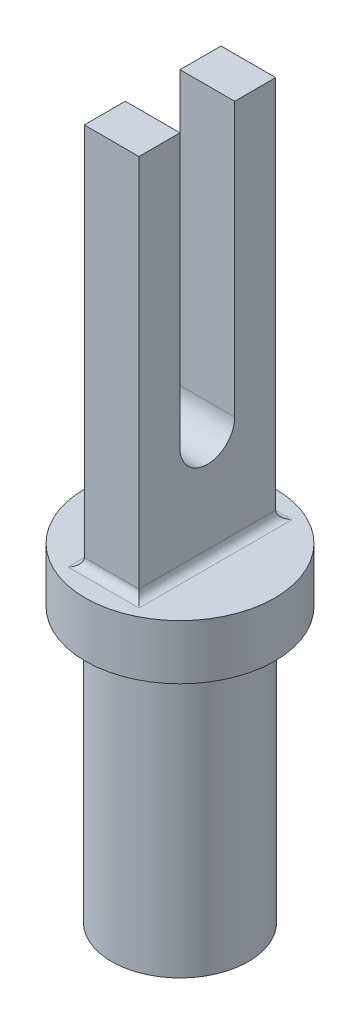
ISO-10303-21;
HEADER;
FILE_DESCRIPTION(('STEP AP214'),'2;1');
FILE_NAME('part.step','',(''),(''),'','','');
FILE_SCHEMA(('AUTOMOTIVE_DESIGN { 1 0 10303 214 1 1 1 1 }'));
ENDSEC;
DATA;
#1=APPLICATION_CONTEXT('core data for automotive mechanical design processes');
#2=APPLICATION_PROTOCOL_DEFINITION('international standard','automotive_design',2000,#1);
#3=PRODUCT_CONTEXT('',#1,'mechanical');
#4=PRODUCT('Part','Part','',(#3));
#5=PRODUCT_RELATED_PRODUCT_CATEGORY('part','',(#4));
#6=PRODUCT_DEFINITION_FORMATION('','',#4);
#7=PRODUCT_DEFINITION_CONTEXT('part definition',#1,'design');
#8=PRODUCT_DEFINITION('design','',#6,#7);
#9=PRODUCT_DEFINITION_SHAPE('','',#8);
#10=(LENGTH_UNIT() NAMED_UNIT(*) SI_UNIT(.MILLI.,.METRE.));
#11=(NAMED_UNIT(*) PLANE_ANGLE_UNIT() SI_UNIT($,.RADIAN.));
#12=(NAMED_UNIT(*) SI_UNIT($,.STERADIAN.) SOLID_ANGLE_UNIT());
#13=UNCERTAINTY_MEASURE_WITH_UNIT(LENGTH_MEASURE(1.E-05),#10,'distance_accuracy_value','');
#14=(GEOMETRIC_REPRESENTATION_CONTEXT(3) GLOBAL_UNCERTAINTY_ASSIGNED_CONTEXT((#13)) GLOBAL_UNIT_ASSIGNED_CONTEXT((#10,
#11,#12)) REPRESENTATION_CONTEXT('',''));
#15=CARTESIAN_POINT('',(0.,0.,0.));
#16=DIRECTION('',(0.,0.,1.));
#17=DIRECTION('',(1.,0.,0.));
#18=AXIS2_PLACEMENT_3D('',#15,#16,#17);
#19=CARTESIAN_POINT('',(5.,70.,12.5));
#20=DIRECTION('',(-1.,0.,0.));
#21=DIRECTION('',(0.,0.,1.));
#22=AXIS2_PLACEMENT_3D('',#19,#20,#21);
#23=PLANE('',#22);
#24=DIRECTION('',(0.,1.,0.));
#25=VECTOR('',#24,1.);
#26=CARTESIAN_POINT('',(5.,70.,-4.99999999999999));
#27=LINE('',#26,#25);
#28=CARTESIAN_POINT('',(5.,20.,-4.99999999999999));
#29=VERTEX_POINT('',#28);
#30=CARTESIAN_POINT('',(5.,70.,-4.99999999999999));
#31=VERTEX_POINT('',#30);
#32=EDGE_CURVE('E138',#29,#31,#27,.T.);
#33=ORIENTED_EDGE('',*,*,#32,.F.);
#34=CARTESIAN_POINT('',(5.,20.,0.));
#35=DIRECTION('',(-1.,0.,0.));
#36=DIRECTION('',(0.,0.,1.));
#37=AXIS2_PLACEMENT_3D('',#34,#35,#36);
#38=CIRCLE('',#37,5.);
#39=CARTESIAN_POINT('',(5.,20.,5.));
#40=VERTEX_POINT('',#39);
#41=EDGE_CURVE('E119',#29,#40,#38,.T.);
#42=ORIENTED_EDGE('',*,*,#41,.T.);
#43=DIRECTION('',(0.,-1.,0.));
#44=VECTOR('',#43,1.);
#45=CARTESIAN_POINT('',(5.,70.,4.99999999999999));
#46=LINE('',#45,#44);
#47=CARTESIAN_POINT('',(5.,70.,4.99999999999999));
#48=VERTEX_POINT('',#47);
#49=EDGE_CURVE('E135',#48,#40,#46,.T.);
#50=ORIENTED_EDGE('',*,*,#49,.F.);
#51=DIRECTION('',(0.,0.,-1.));
#52=VECTOR('',#51,1.);
#53=CARTESIAN_POINT('',(5.,70.,12.5));
#54=LINE('',#53,#52);
#55=CARTESIAN_POINT('',(5.,70.,12.5));
#56=VERTEX_POINT('',#55);
#57=EDGE_CURVE('E142',#56,#48,#54,.T.);
#58=ORIENTED_EDGE('',*,*,#57,.F.);
#59=DIRECTION('',(0.,-1.,0.));
#60=VECTOR('',#59,1.);
#61=CARTESIAN_POINT('',(5.,70.,12.5));
#62=LINE('',#61,#60);
#63=CARTESIAN_POINT('',(5.,1.5,12.5));
#64=VERTEX_POINT('',#63);
#65=EDGE_CURVE('E153',#56,#64,#62,.T.);
#66=ORIENTED_EDGE('',*,*,#65,.T.);
#67=DIRECTION('',(0.,0.,-1.));
#68=VECTOR('',#67,1.);
#69=CARTESIAN_POINT('',(5.,1.5,12.5));
#70=LINE('',#69,#68);
#71=CARTESIAN_POINT('',(5.,1.5,-12.5));
#72=VERTEX_POINT('',#71);
#73=EDGE_CURVE('E187',#64,#72,#70,.T.);
#74=ORIENTED_EDGE('',*,*,#73,.T.);
#75=DIRECTION('',(0.,-1.,0.));
#76=VECTOR('',#75,1.);
#77=CARTESIAN_POINT('',(5.,70.,-12.5));
#78=LINE('',#77,#76);
#79=CARTESIAN_POINT('',(5.,70.,-12.5));
#80=VERTEX_POINT('',#79);
#81=EDGE_CURVE('E160',#80,#72,#78,.T.);
#82=ORIENTED_EDGE('',*,*,#81,.F.);
#83=EDGE_CURVE('E146',#31,#80,#54,.T.);
#84=ORIENTED_EDGE('',*,*,#83,.F.);
#85=EDGE_LOOP('',(#33,#42,#50,#58,#66,#74,#82,#84));
#86=FACE_BOUND('',#85,.T.);
#87=ADVANCED_FACE('F33',(#86),#23,.F.);
#88=CARTESIAN_POINT('',(-5.,70.,12.5));
#89=DIRECTION('',(1.,0.,0.));
#90=DIRECTION('',(0.,0.,-1.));
#91=AXIS2_PLACEMENT_3D('',#88,#89,#90);
#92=PLANE('',#91);
#93=DIRECTION('',(0.,1.,0.));
#94=VECTOR('',#93,1.);
#95=CARTESIAN_POINT('',(-5.,0.,-4.99999999999999));
#96=LINE('',#95,#94);
#97=CARTESIAN_POINT('',(-5.,20.,-4.99999999999999));
#98=VERTEX_POINT('',#97);
#99=CARTESIAN_POINT('',(-5.,70.,-4.99999999999999));
#100=VERTEX_POINT('',#99);
#101=EDGE_CURVE('E125',#98,#100,#96,.T.);
#102=ORIENTED_EDGE('',*,*,#101,.T.);
#103=DIRECTION('',(0.,0.,1.));
#104=VECTOR('',#103,1.);
#105=CARTESIAN_POINT('',(-5.,70.,12.5));
#106=LINE('',#105,#104);
#107=CARTESIAN_POINT('',(-5.,70.,-12.5));
#108=VERTEX_POINT('',#107);
#109=EDGE_CURVE('E149',#108,#100,#106,.T.);
#110=ORIENTED_EDGE('',*,*,#109,.F.);
#111=DIRECTION('',(0.,-1.,0.));
#112=VECTOR('',#111,1.);
#113=CARTESIAN_POINT('',(-5.,70.,-12.5));
#114=LINE('',#113,#112);
#115=CARTESIAN_POINT('',(-5.,1.5,-12.5));
#116=VERTEX_POINT('',#115);
#117=EDGE_CURVE('E158',#108,#116,#114,.T.);
#118=ORIENTED_EDGE('',*,*,#117,.T.);
#119=DIRECTION('',(0.,0.,1.));
#120=VECTOR('',#119,1.);
#121=CARTESIAN_POINT('',(-5.,1.5,12.5));
#122=LINE('',#121,#120);
#123=CARTESIAN_POINT('',(-5.,1.5,12.5));
#124=VERTEX_POINT('',#123);
#125=EDGE_CURVE('E56',#116,#124,#122,.T.);
#126=ORIENTED_EDGE('',*,*,#125,.T.);
#127=DIRECTION('',(0.,-1.,0.));
#128=VECTOR('',#127,1.);
#129=CARTESIAN_POINT('',(-5.,70.,12.5));
#130=LINE('',#129,#128);
#131=CARTESIAN_POINT('',(-5.,70.,12.5));
#132=VERTEX_POINT('',#131);
#133=EDGE_CURVE('E156',#132,#124,#130,.T.);
#134=ORIENTED_EDGE('',*,*,#133,.F.);
#135=CARTESIAN_POINT('',(-5.,70.,5.00000000000001));
#136=VERTEX_POINT('',#135);
#137=EDGE_CURVE('E148',#136,#132,#106,.T.);
#138=ORIENTED_EDGE('',*,*,#137,.F.);
#139=DIRECTION('',(0.,-1.,0.));
#140=VECTOR('',#139,1.);
#141=CARTESIAN_POINT('',(-5.,0.,4.99999999999999));
#142=LINE('',#141,#140);
#143=CARTESIAN_POINT('',(-5.,20.,5.));
#144=VERTEX_POINT('',#143);
#145=EDGE_CURVE('E48',#136,#144,#142,.T.);
#146=ORIENTED_EDGE('',*,*,#145,.T.);
#147=CARTESIAN_POINT('',(-5.,20.,0.));
#148=DIRECTION('',(-1.,0.,0.));
#149=DIRECTION('',(0.,0.,1.));
#150=AXIS2_PLACEMENT_3D('',#147,#148,#149);
#151=CIRCLE('',#150,5.);
#152=EDGE_CURVE('E117',#98,#144,#151,.T.);
#153=ORIENTED_EDGE('',*,*,#152,.F.);
#154=EDGE_LOOP('',(#102,#110,#118,#126,#134,#138,#146,#153));
#155=FACE_BOUND('',#154,.T.);
#156=ADVANCED_FACE('F130',(#155),#92,.F.);
#157=CARTESIAN_POINT('',(0.,70.,0.));
#158=DIRECTION('',(0.,1.,0.));
#159=DIRECTION('',(0.,0.,1.));
#160=AXIS2_PLACEMENT_3D('',#157,#158,#159);
#161=PLANE('',#160);
#162=ORIENTED_EDGE('',*,*,#109,.T.);
#163=DIRECTION('',(1.,0.,0.));
#164=VECTOR('',#163,1.);
#165=CARTESIAN_POINT('',(0.,70.,-4.99999999999999));
#166=LINE('',#165,#164);
#167=EDGE_CURVE('E11',#100,#31,#166,.T.);
#168=ORIENTED_EDGE('',*,*,#167,.T.);
#169=ORIENTED_EDGE('',*,*,#83,.T.);
#170=DIRECTION('',(-1.,0.,0.));
#171=VECTOR('',#170,1.);
#172=CARTESIAN_POINT('',(5.,70.,-12.5));
#173=LINE('',#172,#171);
#174=EDGE_CURVE('E145',#80,#108,#173,.T.);
#175=ORIENTED_EDGE('',*,*,#174,.T.);
#176=EDGE_LOOP('',(#162,#168,#169,#175));
#177=FACE_BOUND('',#176,.T.);
#178=ADVANCED_FACE('F225',(#177),#161,.T.);
#179=ORIENTED_EDGE('',*,*,#57,.T.);
#180=DIRECTION('',(-1.,0.,0.));
#181=VECTOR('',#180,1.);
#182=CARTESIAN_POINT('',(0.,70.,4.99999999999999));
#183=LINE('',#182,#181);
#184=EDGE_CURVE('E41',#48,#136,#183,.T.);
#185=ORIENTED_EDGE('',*,*,#184,.T.);
#186=ORIENTED_EDGE('',*,*,#137,.T.);
#187=DIRECTION('',(1.,0.,0.));
#188=VECTOR('',#187,1.);
#189=CARTESIAN_POINT('',(5.,70.,12.5));
#190=LINE('',#189,#188);
#191=EDGE_CURVE('E151',#132,#56,#190,.T.);
#192=ORIENTED_EDGE('',*,*,#191,.T.);
#193=EDGE_LOOP('',(#179,#185,#186,#192));
#194=FACE_BOUND('',#193,.T.);
#195=ADVANCED_FACE('F201',(#194),#161,.T.);
#196=CARTESIAN_POINT('',(0.,-10.,0.));
#197=DIRECTION('',(0.,1.,0.));
#198=DIRECTION('',(0.,0.,1.));
#199=AXIS2_PLACEMENT_3D('',#196,#197,#198);
#200=CYLINDRICAL_SURFACE('',#199,17.325);
#201=CARTESIAN_POINT('',(0.,-10.,0.));
#202=DIRECTION('',(0.,1.,0.));
#203=DIRECTION('',(0.,0.,1.));
#204=AXIS2_PLACEMENT_3D('',#201,#202,#203);
#205=CIRCLE('',#204,17.325);
#206=CARTESIAN_POINT('',(0.,-10.,17.325));
#207=VERTEX_POINT('',#206);
#208=EDGE_CURVE('E171',#207,#207,#205,.T.);
#209=ORIENTED_EDGE('',*,*,#208,.T.);
#210=EDGE_LOOP('',(#209));
#211=FACE_BOUND('',#210,.T.);
#212=CARTESIAN_POINT('',(0.,0.,0.));
#213=DIRECTION('',(0.,1.,0.));
#214=DIRECTION('',(0.,0.,1.));
#215=AXIS2_PLACEMENT_3D('',#212,#213,#214);
#216=CIRCLE('',#215,17.325);
#217=CARTESIAN_POINT('',(0.,0.,17.325));
#218=VERTEX_POINT('',#217);
#219=EDGE_CURVE('E166',#218,#218,#216,.T.);
#220=ORIENTED_EDGE('',*,*,#219,.F.);
#221=EDGE_LOOP('',(#220));
#222=FACE_BOUND('',#221,.T.);
#223=ADVANCED_FACE('F242',(#211,#222),#200,.T.);
#224=CARTESIAN_POINT('',(0.,-10.,0.));
#225=DIRECTION('',(0.,1.,0.));
#226=DIRECTION('',(0.,0.,1.));
#227=AXIS2_PLACEMENT_3D('',#224,#225,#226);
#228=PLANE('',#227);
#229=CARTESIAN_POINT('',(0.,-10.,0.));
#230=DIRECTION('',(0.,-1.,0.));
#231=DIRECTION('',(0.,0.,-1.));
#232=AXIS2_PLACEMENT_3D('',#229,#230,#231);
#233=CIRCLE('',#232,12.5);
#234=CARTESIAN_POINT('',(0.,-10.,-12.5));
#235=VERTEX_POINT('',#234);
#236=EDGE_CURVE('E167',#235,#235,#233,.T.);
#237=ORIENTED_EDGE('',*,*,#236,.F.);
#238=EDGE_LOOP('',(#237));
#239=FACE_BOUND('',#238,.T.);
#240=ORIENTED_EDGE('',*,*,#208,.F.);
#241=EDGE_LOOP('',(#240));
#242=FACE_BOUND('',#241,.T.);
#243=ADVANCED_FACE('F239',(#239,#242),#228,.F.);
#244=CARTESIAN_POINT('',(0.,0.,0.));
#245=DIRECTION('',(0.,1.,0.));
#246=DIRECTION('',(0.,0.,1.));
#247=AXIS2_PLACEMENT_3D('',#244,#245,#246);
#248=PLANE('',#247);
#249=DIRECTION('',(0.,0.,1.));
#250=VECTOR('',#249,1.);
#251=CARTESIAN_POINT('',(-6.5,0.,0.));
#252=LINE('',#251,#250);
#253=CARTESIAN_POINT('',(-6.5,0.,14.));
#254=VERTEX_POINT('',#253);
#255=CARTESIAN_POINT('',(-6.5,0.,-14.));
#256=VERTEX_POINT('',#255);
#257=EDGE_CURVE('E178',#254,#256,#252,.F.);
#258=ORIENTED_EDGE('',*,*,#257,.T.);
#259=DIRECTION('',(-1.,0.,0.));
#260=VECTOR('',#259,1.);
#261=CARTESIAN_POINT('',(0.,0.,-14.));
#262=LINE('',#261,#260);
#263=CARTESIAN_POINT('',(6.5,0.,-14.));
#264=VERTEX_POINT('',#263);
#265=EDGE_CURVE('E184',#256,#264,#262,.F.);
#266=ORIENTED_EDGE('',*,*,#265,.T.);
#267=DIRECTION('',(0.,0.,-1.));
#268=VECTOR('',#267,1.);
#269=CARTESIAN_POINT('',(6.5,0.,0.));
#270=LINE('',#269,#268);
#271=CARTESIAN_POINT('',(6.5,0.,14.));
#272=VERTEX_POINT('',#271);
#273=EDGE_CURVE('E182',#264,#272,#270,.F.);
#274=ORIENTED_EDGE('',*,*,#273,.T.);
#275=DIRECTION('',(1.,0.,0.));
#276=VECTOR('',#275,1.);
#277=CARTESIAN_POINT('',(0.,0.,14.));
#278=LINE('',#277,#276);
#279=EDGE_CURVE('E180',#272,#254,#278,.F.);
#280=ORIENTED_EDGE('',*,*,#279,.T.);
#281=EDGE_LOOP('',(#258,#266,#274,#280));
#282=FACE_BOUND('',#281,.T.);
#283=ORIENTED_EDGE('',*,*,#219,.T.);
#284=EDGE_LOOP('',(#283));
#285=FACE_BOUND('',#284,.T.);
#286=ADVANCED_FACE('F237',(#282,#285),#248,.T.);
#287=CARTESIAN_POINT('',(0.,-60.,0.));
#288=DIRECTION('',(0.,1.,0.));
#289=DIRECTION('',(0.,0.,1.));
#290=AXIS2_PLACEMENT_3D('',#287,#288,#289);
#291=CYLINDRICAL_SURFACE('',#290,12.5);
#292=CARTESIAN_POINT('',(0.,-60.,0.));
#293=DIRECTION('',(0.,-1.,0.));
#294=DIRECTION('',(0.,0.,-1.));
#295=AXIS2_PLACEMENT_3D('',#292,#293,#294);
#296=CIRCLE('',#295,12.5);
#297=CARTESIAN_POINT('',(0.,-60.,-12.5));
#298=VERTEX_POINT('',#297);
#299=EDGE_CURVE('E163',#298,#298,#296,.T.);
#300=ORIENTED_EDGE('',*,*,#299,.F.);
#301=EDGE_LOOP('',(#300));
#302=FACE_BOUND('',#301,.T.);
#303=ORIENTED_EDGE('',*,*,#236,.T.);
#304=EDGE_LOOP('',(#303));
#305=FACE_BOUND('',#304,.T.);
#306=ADVANCED_FACE('F233',(#302,#305),#291,.T.);
#307=CARTESIAN_POINT('',(0.,-60.,0.));
#308=DIRECTION('',(0.,-1.,0.));
#309=DIRECTION('',(0.,0.,-1.));
#310=AXIS2_PLACEMENT_3D('',#307,#308,#309);
#311=PLANE('',#310);
#312=ORIENTED_EDGE('',*,*,#299,.T.);
#313=EDGE_LOOP('',(#312));
#314=FACE_BOUND('',#313,.T.);
#315=ADVANCED_FACE('F230',(#314),#311,.T.);
#316=CARTESIAN_POINT('',(5.,70.,-12.5));
#317=DIRECTION('',(0.,0.,1.));
#318=DIRECTION('',(1.,0.,0.));
#319=AXIS2_PLACEMENT_3D('',#316,#317,#318);
#320=PLANE('',#319);
#321=ORIENTED_EDGE('',*,*,#81,.T.);
#322=DIRECTION('',(-1.,0.,0.));
#323=VECTOR('',#322,1.);
#324=CARTESIAN_POINT('',(5.,1.5,-12.5));
#325=LINE('',#324,#323);
#326=EDGE_CURVE('E170',#72,#116,#325,.T.);
#327=ORIENTED_EDGE('',*,*,#326,.T.);
#328=ORIENTED_EDGE('',*,*,#117,.F.);
#329=ORIENTED_EDGE('',*,*,#174,.F.);
#330=EDGE_LOOP('',(#321,#327,#328,#329));
#331=FACE_BOUND('',#330,.T.);
#332=ADVANCED_FACE('F229',(#331),#320,.F.);
#333=CARTESIAN_POINT('',(5.,70.,12.5));
#334=DIRECTION('',(0.,0.,-1.));
#335=DIRECTION('',(-1.,0.,0.));
#336=AXIS2_PLACEMENT_3D('',#333,#334,#335);
#337=PLANE('',#336);
#338=ORIENTED_EDGE('',*,*,#133,.T.);
#339=DIRECTION('',(1.,0.,0.));
#340=VECTOR('',#339,1.);
#341=CARTESIAN_POINT('',(5.,1.5,12.5));
#342=LINE('',#341,#340);
#343=EDGE_CURVE('E189',#124,#64,#342,.T.);
#344=ORIENTED_EDGE('',*,*,#343,.T.);
#345=ORIENTED_EDGE('',*,*,#65,.F.);
#346=ORIENTED_EDGE('',*,*,#191,.F.);
#347=EDGE_LOOP('',(#338,#344,#345,#346));
#348=FACE_BOUND('',#347,.T.);
#349=ADVANCED_FACE('F208',(#348),#337,.F.);
#350=CARTESIAN_POINT('',(5.,1.5,14.));
#351=DIRECTION('',(1.,0.,0.));
#352=DIRECTION('',(0.,0.,-1.));
#353=AXIS2_PLACEMENT_3D('',#350,#351,#352);
#354=CYLINDRICAL_SURFACE('',#353,1.5);
#355=CARTESIAN_POINT('',(-6.5,1.5,14.));
#356=DIRECTION('',(0.707106781186548,0.,0.707106781186547));
#357=DIRECTION('',(-0.707106781186547,0.,0.707106781186548));
#358=AXIS2_PLACEMENT_3D('',#355,#356,#357);
#359=ELLIPSE('',#358,2.12132034355964,1.5);
#360=EDGE_CURVE('E195',#254,#124,#359,.T.);
#361=ORIENTED_EDGE('',*,*,#360,.F.);
#362=ORIENTED_EDGE('',*,*,#279,.F.);
#363=CARTESIAN_POINT('',(6.5,1.5,14.));
#364=DIRECTION('',(0.707106781186547,0.,-0.707106781186548));
#365=DIRECTION('',(0.707106781186548,0.,0.707106781186547));
#366=AXIS2_PLACEMENT_3D('',#363,#364,#365);
#367=ELLIPSE('',#366,2.12132034355964,1.5);
#368=EDGE_CURVE('E198',#64,#272,#367,.F.);
#369=ORIENTED_EDGE('',*,*,#368,.F.);
#370=ORIENTED_EDGE('',*,*,#343,.F.);
#371=EDGE_LOOP('',(#361,#362,#369,#370));
#372=FACE_BOUND('',#371,.T.);
#373=ADVANCED_FACE('F35',(#372),#354,.F.);
#374=CARTESIAN_POINT('',(6.5,1.5,12.5));
#375=DIRECTION('',(0.,0.,-1.));
#376=DIRECTION('',(-1.,0.,0.));
#377=AXIS2_PLACEMENT_3D('',#374,#375,#376);
#378=CYLINDRICAL_SURFACE('',#377,1.5);
#379=ORIENTED_EDGE('',*,*,#368,.T.);
#380=ORIENTED_EDGE('',*,*,#273,.F.);
#381=CARTESIAN_POINT('',(6.5,1.5,-14.));
#382=DIRECTION('',(-0.707106781186547,0.,-0.707106781186547));
#383=DIRECTION('',(0.707106781186547,0.,-0.707106781186547));
#384=AXIS2_PLACEMENT_3D('',#381,#382,#383);
#385=ELLIPSE('',#384,2.12132034355964,1.5);
#386=EDGE_CURVE('E193',#72,#264,#385,.F.);
#387=ORIENTED_EDGE('',*,*,#386,.F.);
#388=ORIENTED_EDGE('',*,*,#73,.F.);
#389=EDGE_LOOP('',(#379,#380,#387,#388));
#390=FACE_BOUND('',#389,.T.);
#391=ADVANCED_FACE('F256',(#390),#378,.F.);
#392=CARTESIAN_POINT('',(-6.5,1.5,12.5));
#393=DIRECTION('',(0.,0.,1.));
#394=DIRECTION('',(1.,0.,0.));
#395=AXIS2_PLACEMENT_3D('',#392,#393,#394);
#396=CYLINDRICAL_SURFACE('',#395,1.5);
#397=ORIENTED_EDGE('',*,*,#360,.T.);
#398=ORIENTED_EDGE('',*,*,#125,.F.);
#399=CARTESIAN_POINT('',(-6.5,1.5,-14.));
#400=DIRECTION('',(-0.707106781186547,0.,0.707106781186547));
#401=DIRECTION('',(0.707106781186547,0.,0.707106781186547));
#402=AXIS2_PLACEMENT_3D('',#399,#400,#401);
#403=ELLIPSE('',#402,2.12132034355964,1.5);
#404=EDGE_CURVE('E141',#256,#116,#403,.T.);
#405=ORIENTED_EDGE('',*,*,#404,.F.);
#406=ORIENTED_EDGE('',*,*,#257,.F.);
#407=EDGE_LOOP('',(#397,#398,#405,#406));
#408=FACE_BOUND('',#407,.T.);
#409=ADVANCED_FACE('F253',(#408),#396,.F.);
#410=CARTESIAN_POINT('',(5.,1.5,-14.));
#411=DIRECTION('',(-1.,0.,0.));
#412=DIRECTION('',(0.,0.,1.));
#413=AXIS2_PLACEMENT_3D('',#410,#411,#412);
#414=CYLINDRICAL_SURFACE('',#413,1.5);
#415=ORIENTED_EDGE('',*,*,#386,.T.);
#416=ORIENTED_EDGE('',*,*,#265,.F.);
#417=ORIENTED_EDGE('',*,*,#404,.T.);
#418=ORIENTED_EDGE('',*,*,#326,.F.);
#419=EDGE_LOOP('',(#415,#416,#417,#418));
#420=FACE_BOUND('',#419,.T.);
#421=ADVANCED_FACE('F250',(#420),#414,.F.);
#422=CARTESIAN_POINT('',(17.325,20.,0.));
#423=DIRECTION('',(-1.,0.,0.));
#424=DIRECTION('',(0.,0.,1.));
#425=AXIS2_PLACEMENT_3D('',#422,#423,#424);
#426=CYLINDRICAL_SURFACE('',#425,5.);
#427=DIRECTION('',(-1.,0.,0.));
#428=VECTOR('',#427,1.);
#429=CARTESIAN_POINT('',(17.325,20.,-4.99999999999999));
#430=LINE('',#429,#428);
#431=EDGE_CURVE('E112',#29,#98,#430,.T.);
#432=ORIENTED_EDGE('',*,*,#431,.T.);
#433=ORIENTED_EDGE('',*,*,#152,.T.);
#434=DIRECTION('',(-1.,0.,0.));
#435=VECTOR('',#434,1.);
#436=CARTESIAN_POINT('',(17.325,20.,5.));
#437=LINE('',#436,#435);
#438=EDGE_CURVE('E122',#40,#144,#437,.T.);
#439=ORIENTED_EDGE('',*,*,#438,.F.);
#440=ORIENTED_EDGE('',*,*,#41,.F.);
#441=EDGE_LOOP('',(#432,#433,#439,#440));
#442=FACE_BOUND('',#441,.T.);
#443=ADVANCED_FACE('F114',(#442),#426,.F.);
#444=CARTESIAN_POINT('',(17.325,0.,-4.99999999999999));
#445=DIRECTION('',(0.,0.,1.));
#446=DIRECTION('',(1.,0.,0.));
#447=AXIS2_PLACEMENT_3D('',#444,#445,#446);
#448=PLANE('',#447);
#449=ORIENTED_EDGE('',*,*,#32,.T.);
#450=ORIENTED_EDGE('',*,*,#167,.F.);
#451=ORIENTED_EDGE('',*,*,#101,.F.);
#452=ORIENTED_EDGE('',*,*,#431,.F.);
#453=EDGE_LOOP('',(#449,#450,#451,#452));
#454=FACE_BOUND('',#453,.T.);
#455=ADVANCED_FACE('F126',(#454),#448,.T.);
#456=CARTESIAN_POINT('',(17.325,0.,4.99999999999999));
#457=DIRECTION('',(0.,0.,-1.));
#458=DIRECTION('',(-1.,0.,0.));
#459=AXIS2_PLACEMENT_3D('',#456,#457,#458);
#460=PLANE('',#459);
#461=ORIENTED_EDGE('',*,*,#49,.T.);
#462=ORIENTED_EDGE('',*,*,#438,.T.);
#463=ORIENTED_EDGE('',*,*,#145,.F.);
#464=ORIENTED_EDGE('',*,*,#184,.F.);
#465=EDGE_LOOP('',(#461,#462,#463,#464));
#466=FACE_BOUND('',#465,.T.);
#467=ADVANCED_FACE('F211',(#466),#460,.T.);
#468=CLOSED_SHELL('',(#87,#156,#178,#195,#223,#243,#286,#306,#315,#332,#349,#373,#391,#409,#421,
#443,#455,#467));
#469=MANIFOLD_SOLID_BREP('B2',#468);
#470=ADVANCED_BREP_SHAPE_REPRESENTATION('',(#18,#469),#14);
#471=SHAPE_DEFINITION_REPRESENTATION(#9,#470);
ENDSEC;
END-ISO-10303-21;
